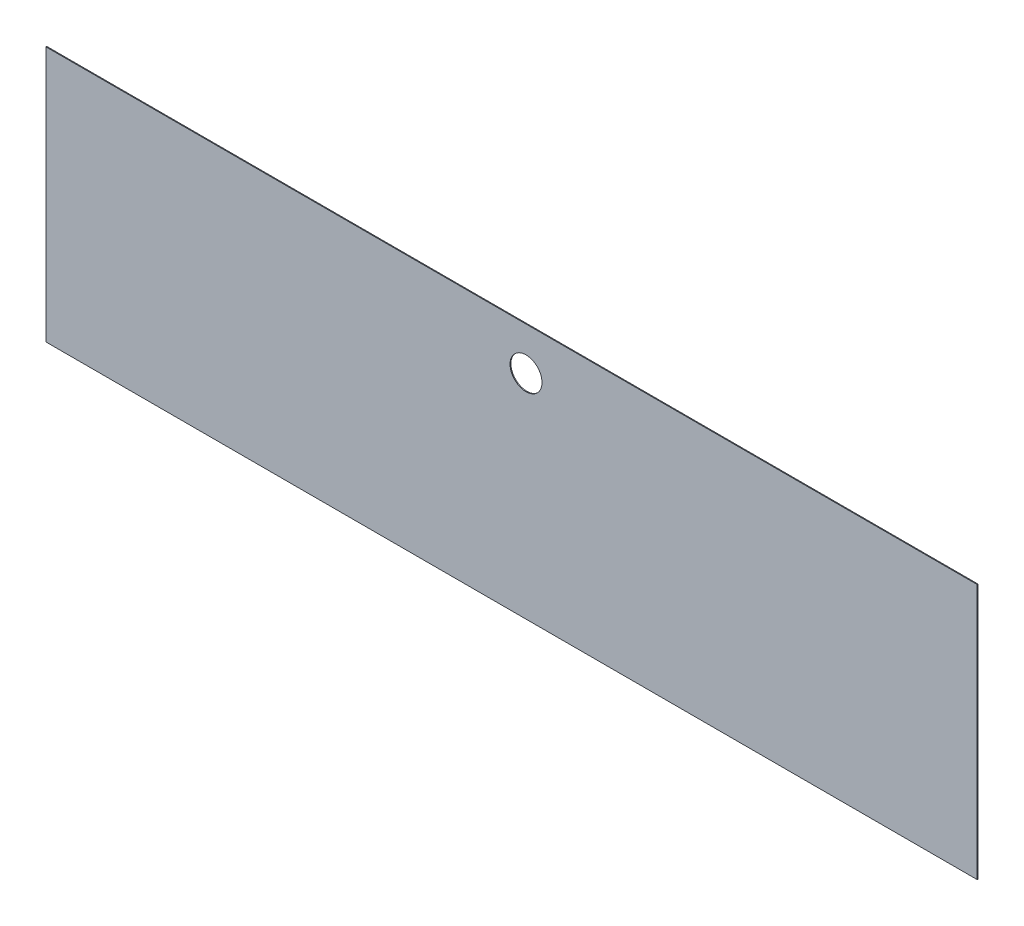
ISO-10303-21;
HEADER;
FILE_DESCRIPTION(('STEP AP214'),'2;1');
FILE_NAME('part.step','',(''),(''),'','','');
FILE_SCHEMA(('AUTOMOTIVE_DESIGN { 1 0 10303 214 1 1 1 1 }'));
ENDSEC;
DATA;
#1=APPLICATION_CONTEXT('core data for automotive mechanical design processes');
#2=APPLICATION_PROTOCOL_DEFINITION('international standard','automotive_design',2000,#1);
#3=PRODUCT_CONTEXT('',#1,'mechanical');
#4=PRODUCT('Part','Part','',(#3));
#5=PRODUCT_RELATED_PRODUCT_CATEGORY('part','',(#4));
#6=PRODUCT_DEFINITION_FORMATION('','',#4);
#7=PRODUCT_DEFINITION_CONTEXT('part definition',#1,'design');
#8=PRODUCT_DEFINITION('design','',#6,#7);
#9=PRODUCT_DEFINITION_SHAPE('','',#8);
#10=(LENGTH_UNIT() NAMED_UNIT(*) SI_UNIT(.MILLI.,.METRE.));
#11=(NAMED_UNIT(*) PLANE_ANGLE_UNIT() SI_UNIT($,.RADIAN.));
#12=(NAMED_UNIT(*) SI_UNIT($,.STERADIAN.) SOLID_ANGLE_UNIT());
#13=UNCERTAINTY_MEASURE_WITH_UNIT(LENGTH_MEASURE(1.E-05),#10,'distance_accuracy_value','');
#14=(GEOMETRIC_REPRESENTATION_CONTEXT(3) GLOBAL_UNCERTAINTY_ASSIGNED_CONTEXT((#13)) GLOBAL_UNIT_ASSIGNED_CONTEXT((#10,
#11,#12)) REPRESENTATION_CONTEXT('',''));
#15=CARTESIAN_POINT('',(0.,0.,0.));
#16=DIRECTION('',(0.,0.,1.));
#17=DIRECTION('',(1.,0.,0.));
#18=AXIS2_PLACEMENT_3D('',#15,#16,#17);
#19=CARTESIAN_POINT('',(-1093.,-300.,2.));
#20=DIRECTION('',(1.,0.,0.));
#21=DIRECTION('',(0.,0.,-1.));
#22=AXIS2_PLACEMENT_3D('',#19,#20,#21);
#23=PLANE('',#22);
#24=DIRECTION('',(0.,-1.,0.));
#25=VECTOR('',#24,1.);
#26=CARTESIAN_POINT('',(-1093.,-300.,0.));
#27=LINE('',#26,#25);
#28=CARTESIAN_POINT('',(-1093.,300.,0.));
#29=VERTEX_POINT('',#28);
#30=CARTESIAN_POINT('',(-1093.,-300.,0.));
#31=VERTEX_POINT('',#30);
#32=EDGE_CURVE('E93',#29,#31,#27,.T.);
#33=ORIENTED_EDGE('',*,*,#32,.T.);
#34=DIRECTION('',(0.,0.,-1.));
#35=VECTOR('',#34,1.);
#36=CARTESIAN_POINT('',(-1093.,-300.,2.));
#37=LINE('',#36,#35);
#38=CARTESIAN_POINT('',(-1093.,-300.,2.));
#39=VERTEX_POINT('',#38);
#40=EDGE_CURVE('E11',#39,#31,#37,.T.);
#41=ORIENTED_EDGE('',*,*,#40,.F.);
#42=DIRECTION('',(0.,-1.,0.));
#43=VECTOR('',#42,1.);
#44=CARTESIAN_POINT('',(-1093.,-300.,2.));
#45=LINE('',#44,#43);
#46=CARTESIAN_POINT('',(-1093.,300.,2.));
#47=VERTEX_POINT('',#46);
#48=EDGE_CURVE('E81',#47,#39,#45,.T.);
#49=ORIENTED_EDGE('',*,*,#48,.F.);
#50=DIRECTION('',(0.,0.,-1.));
#51=VECTOR('',#50,1.);
#52=CARTESIAN_POINT('',(-1093.,300.,2.));
#53=LINE('',#52,#51);
#54=EDGE_CURVE('E89',#47,#29,#53,.T.);
#55=ORIENTED_EDGE('',*,*,#54,.T.);
#56=EDGE_LOOP('',(#33,#41,#49,#55));
#57=FACE_BOUND('',#56,.T.);
#58=ADVANCED_FACE('F30',(#57),#23,.F.);
#59=CARTESIAN_POINT('',(1093.,-300.,2.));
#60=DIRECTION('',(0.,1.,0.));
#61=DIRECTION('',(-1.,0.,0.));
#62=AXIS2_PLACEMENT_3D('',#59,#60,#61);
#63=PLANE('',#62);
#64=DIRECTION('',(1.,0.,0.));
#65=VECTOR('',#64,1.);
#66=CARTESIAN_POINT('',(1093.,-300.,0.));
#67=LINE('',#66,#65);
#68=CARTESIAN_POINT('',(1093.,-300.,0.));
#69=VERTEX_POINT('',#68);
#70=EDGE_CURVE('E85',#31,#69,#67,.T.);
#71=ORIENTED_EDGE('',*,*,#70,.T.);
#72=DIRECTION('',(0.,0.,-1.));
#73=VECTOR('',#72,1.);
#74=CARTESIAN_POINT('',(1093.,-300.,2.));
#75=LINE('',#74,#73);
#76=CARTESIAN_POINT('',(1093.,-300.,2.));
#77=VERTEX_POINT('',#76);
#78=EDGE_CURVE('E38',#77,#69,#75,.T.);
#79=ORIENTED_EDGE('',*,*,#78,.F.);
#80=DIRECTION('',(1.,0.,0.));
#81=VECTOR('',#80,1.);
#82=CARTESIAN_POINT('',(1093.,-300.,2.));
#83=LINE('',#82,#81);
#84=EDGE_CURVE('E76',#39,#77,#83,.T.);
#85=ORIENTED_EDGE('',*,*,#84,.F.);
#86=ORIENTED_EDGE('',*,*,#40,.T.);
#87=EDGE_LOOP('',(#71,#79,#85,#86));
#88=FACE_BOUND('',#87,.T.);
#89=ADVANCED_FACE('F84',(#88),#63,.F.);
#90=CARTESIAN_POINT('',(1093.,-300.,2.));
#91=DIRECTION('',(-1.,0.,0.));
#92=DIRECTION('',(0.,0.,1.));
#93=AXIS2_PLACEMENT_3D('',#90,#91,#92);
#94=PLANE('',#93);
#95=DIRECTION('',(0.,1.,0.));
#96=VECTOR('',#95,1.);
#97=CARTESIAN_POINT('',(1093.,-300.,0.));
#98=LINE('',#97,#96);
#99=CARTESIAN_POINT('',(1093.,300.,0.));
#100=VERTEX_POINT('',#99);
#101=EDGE_CURVE('E63',#69,#100,#98,.T.);
#102=ORIENTED_EDGE('',*,*,#101,.T.);
#103=DIRECTION('',(0.,0.,-1.));
#104=VECTOR('',#103,1.);
#105=CARTESIAN_POINT('',(1093.,300.,2.));
#106=LINE('',#105,#104);
#107=CARTESIAN_POINT('',(1093.,300.,2.));
#108=VERTEX_POINT('',#107);
#109=EDGE_CURVE('E86',#108,#100,#106,.T.);
#110=ORIENTED_EDGE('',*,*,#109,.F.);
#111=DIRECTION('',(0.,1.,0.));
#112=VECTOR('',#111,1.);
#113=CARTESIAN_POINT('',(1093.,-300.,2.));
#114=LINE('',#113,#112);
#115=EDGE_CURVE('E79',#77,#108,#114,.T.);
#116=ORIENTED_EDGE('',*,*,#115,.F.);
#117=ORIENTED_EDGE('',*,*,#78,.T.);
#118=EDGE_LOOP('',(#102,#110,#116,#117));
#119=FACE_BOUND('',#118,.T.);
#120=ADVANCED_FACE('F87',(#119),#94,.F.);
#121=CARTESIAN_POINT('',(1093.,300.,2.));
#122=DIRECTION('',(0.,-1.,0.));
#123=DIRECTION('',(1.,0.,0.));
#124=AXIS2_PLACEMENT_3D('',#121,#122,#123);
#125=PLANE('',#124);
#126=DIRECTION('',(-1.,0.,0.));
#127=VECTOR('',#126,1.);
#128=CARTESIAN_POINT('',(1093.,300.,0.));
#129=LINE('',#128,#127);
#130=EDGE_CURVE('E69',#100,#29,#129,.T.);
#131=ORIENTED_EDGE('',*,*,#130,.T.);
#132=ORIENTED_EDGE('',*,*,#54,.F.);
#133=DIRECTION('',(-1.,0.,0.));
#134=VECTOR('',#133,1.);
#135=CARTESIAN_POINT('',(1093.,300.,2.));
#136=LINE('',#135,#134);
#137=EDGE_CURVE('E46',#108,#47,#136,.T.);
#138=ORIENTED_EDGE('',*,*,#137,.F.);
#139=ORIENTED_EDGE('',*,*,#109,.T.);
#140=EDGE_LOOP('',(#131,#132,#138,#139));
#141=FACE_BOUND('',#140,.T.);
#142=ADVANCED_FACE('F101',(#141),#125,.F.);
#143=CARTESIAN_POINT('',(-1093.,300.,2.));
#144=DIRECTION('',(0.,0.,1.));
#145=DIRECTION('',(1.,0.,0.));
#146=AXIS2_PLACEMENT_3D('',#143,#144,#145);
#147=PLANE('',#146);
#148=CARTESIAN_POINT('',(33.9258858062972,199.774015155815,2.));
#149=DIRECTION('',(0.,0.,1.));
#150=DIRECTION('',(1.,0.,0.));
#151=AXIS2_PLACEMENT_3D('',#148,#149,#150);
#152=CIRCLE('',#151,37.5);
#153=CARTESIAN_POINT('',(71.4258858062972,199.774015155815,2.));
#154=VERTEX_POINT('',#153);
#155=EDGE_CURVE('E96',#154,#154,#152,.T.);
#156=ORIENTED_EDGE('',*,*,#155,.F.);
#157=EDGE_LOOP('',(#156));
#158=FACE_BOUND('',#157,.T.);
#159=ORIENTED_EDGE('',*,*,#48,.T.);
#160=ORIENTED_EDGE('',*,*,#84,.T.);
#161=ORIENTED_EDGE('',*,*,#115,.T.);
#162=ORIENTED_EDGE('',*,*,#137,.T.);
#163=EDGE_LOOP('',(#159,#160,#161,#162));
#164=FACE_BOUND('',#163,.T.);
#165=ADVANCED_FACE('F77',(#158,#164),#147,.T.);
#166=CARTESIAN_POINT('',(-1093.,300.,0.));
#167=DIRECTION('',(0.,0.,1.));
#168=DIRECTION('',(1.,0.,0.));
#169=AXIS2_PLACEMENT_3D('',#166,#167,#168);
#170=PLANE('',#169);
#171=CARTESIAN_POINT('',(33.9258858062972,199.774015155815,0.));
#172=DIRECTION('',(0.,0.,-1.));
#173=DIRECTION('',(-1.,0.,0.));
#174=AXIS2_PLACEMENT_3D('',#171,#172,#173);
#175=CIRCLE('',#174,37.5);
#176=CARTESIAN_POINT('',(-3.57411419370283,199.774015155815,0.));
#177=VERTEX_POINT('',#176);
#178=EDGE_CURVE('E109',#177,#177,#175,.T.);
#179=ORIENTED_EDGE('',*,*,#178,.F.);
#180=EDGE_LOOP('',(#179));
#181=FACE_BOUND('',#180,.T.);
#182=ORIENTED_EDGE('',*,*,#32,.F.);
#183=ORIENTED_EDGE('',*,*,#130,.F.);
#184=ORIENTED_EDGE('',*,*,#101,.F.);
#185=ORIENTED_EDGE('',*,*,#70,.F.);
#186=EDGE_LOOP('',(#182,#183,#184,#185));
#187=FACE_BOUND('',#186,.T.);
#188=ADVANCED_FACE('F104',(#181,#187),#170,.F.);
#189=CARTESIAN_POINT('',(33.9258858062972,199.774015155815,10.));
#190=DIRECTION('',(0.,0.,-1.));
#191=DIRECTION('',(-1.,0.,0.));
#192=AXIS2_PLACEMENT_3D('',#189,#190,#191);
#193=CYLINDRICAL_SURFACE('',#192,37.5);
#194=ORIENTED_EDGE('',*,*,#155,.T.);
#195=EDGE_LOOP('',(#194));
#196=FACE_BOUND('',#195,.T.);
#197=ORIENTED_EDGE('',*,*,#178,.T.);
#198=EDGE_LOOP('',(#197));
#199=FACE_BOUND('',#198,.T.);
#200=ADVANCED_FACE('F113',(#196,#199),#193,.F.);
#201=CLOSED_SHELL('',(#58,#89,#120,#142,#165,#188,#200));
#202=MANIFOLD_SOLID_BREP('B2',#201);
#203=ADVANCED_BREP_SHAPE_REPRESENTATION('',(#18,#202),#14);
#204=SHAPE_DEFINITION_REPRESENTATION(#9,#203);
ENDSEC;
END-ISO-10303-21;
